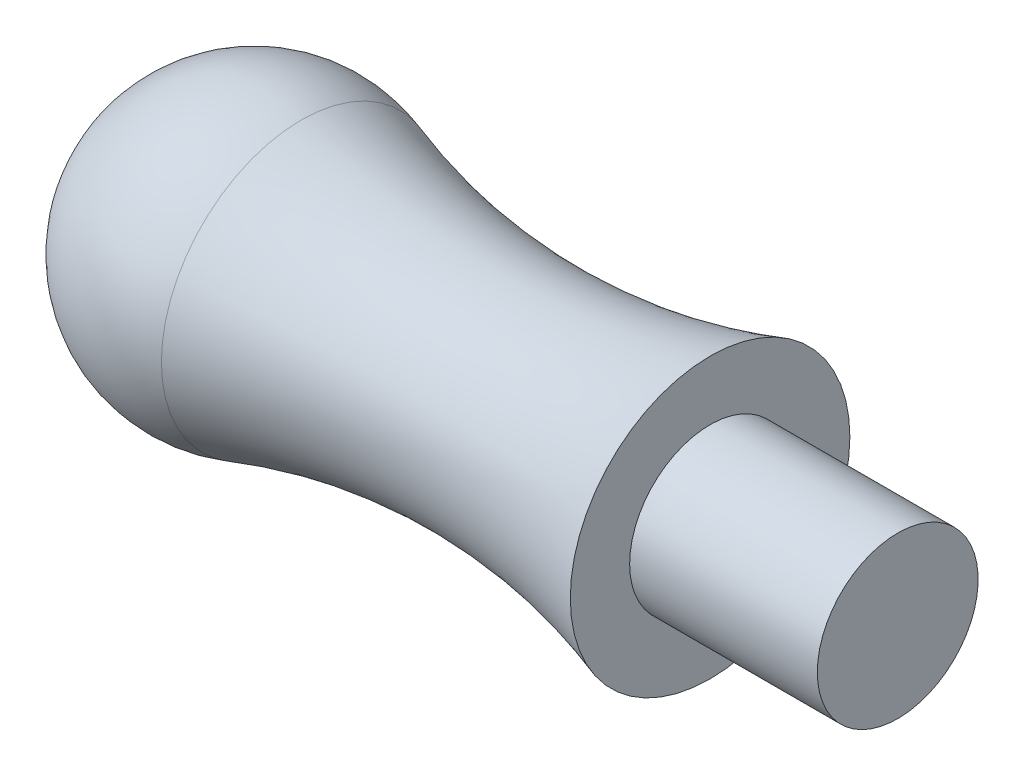
ISO-10303-21;
HEADER;
FILE_DESCRIPTION(('STEP AP214'),'2;1');
FILE_NAME('part.step','',(''),(''),'','','');
FILE_SCHEMA(('AUTOMOTIVE_DESIGN { 1 0 10303 214 1 1 1 1 }'));
ENDSEC;
DATA;
#1=APPLICATION_CONTEXT('core data for automotive mechanical design processes');
#2=APPLICATION_PROTOCOL_DEFINITION('international standard','automotive_design',2000,#1);
#3=PRODUCT_CONTEXT('',#1,'mechanical');
#4=PRODUCT('Part','Part','',(#3));
#5=PRODUCT_RELATED_PRODUCT_CATEGORY('part','',(#4));
#6=PRODUCT_DEFINITION_FORMATION('','',#4);
#7=PRODUCT_DEFINITION_CONTEXT('part definition',#1,'design');
#8=PRODUCT_DEFINITION('design','',#6,#7);
#9=PRODUCT_DEFINITION_SHAPE('','',#8);
#10=(LENGTH_UNIT() NAMED_UNIT(*) SI_UNIT(.MILLI.,.METRE.));
#11=(NAMED_UNIT(*) PLANE_ANGLE_UNIT() SI_UNIT($,.RADIAN.));
#12=(NAMED_UNIT(*) SI_UNIT($,.STERADIAN.) SOLID_ANGLE_UNIT());
#13=UNCERTAINTY_MEASURE_WITH_UNIT(LENGTH_MEASURE(1.E-05),#10,'distance_accuracy_value','');
#14=(GEOMETRIC_REPRESENTATION_CONTEXT(3) GLOBAL_UNCERTAINTY_ASSIGNED_CONTEXT((#13)) GLOBAL_UNIT_ASSIGNED_CONTEXT((#10,
#11,#12)) REPRESENTATION_CONTEXT('',''));
#15=CARTESIAN_POINT('',(0.,0.,0.));
#16=DIRECTION('',(0.,0.,1.));
#17=DIRECTION('',(1.,0.,0.));
#18=AXIS2_PLACEMENT_3D('',#15,#16,#17);
#19=CARTESIAN_POINT('',(9.37383177570094,0.,0.));
#20=DIRECTION('',(-1.,0.,0.));
#21=DIRECTION('',(0.,0.,1.));
#22=AXIS2_PLACEMENT_3D('',#19,#20,#21);
#23=TOROIDAL_SURFACE('',#22,27.9710793113326,24.);
#24=CARTESIAN_POINT('',(1.74766355140187,0.,0.));
#25=DIRECTION('',(-1.,0.,0.));
#26=DIRECTION('',(0.,0.,1.));
#27=AXIS2_PLACEMENT_3D('',#24,#25,#26);
#28=CIRCLE('',#27,5.21494699024845);
#29=CARTESIAN_POINT('',(1.74766355140187,0.,5.21494699024845));
#30=VERTEX_POINT('',#29);
#31=EDGE_CURVE('E10',#30,#30,#28,.T.);
#32=ORIENTED_EDGE('',*,*,#31,.F.);
#33=EDGE_LOOP('',(#32));
#34=FACE_BOUND('',#33,.T.);
#35=CARTESIAN_POINT('',(17.,0.,0.));
#36=DIRECTION('',(-1.,0.,0.));
#37=DIRECTION('',(0.,0.,1.));
#38=AXIS2_PLACEMENT_3D('',#35,#36,#37);
#39=CIRCLE('',#38,5.21494699024845);
#40=CARTESIAN_POINT('',(17.,0.,5.21494699024845));
#41=VERTEX_POINT('',#40);
#42=EDGE_CURVE('E60',#41,#41,#39,.T.);
#43=ORIENTED_EDGE('',*,*,#42,.T.);
#44=EDGE_LOOP('',(#43));
#45=FACE_BOUND('',#44,.T.);
#46=ADVANCED_FACE('F43',(#34,#45),#23,.F.);
#47=CARTESIAN_POINT('',(0.,0.,0.));
#48=DIRECTION('',(-1.,0.,0.));
#49=DIRECTION('',(0.,1.,0.));
#50=AXIS2_PLACEMENT_3D('',#47,#48,#49);
#51=SPHERICAL_SURFACE('',#50,5.5);
#52=ORIENTED_EDGE('',*,*,#31,.T.);
#53=EDGE_LOOP('',(#52));
#54=FACE_BOUND('',#53,.T.);
#55=ADVANCED_FACE('F80',(#54),#51,.T.);
#56=CARTESIAN_POINT('',(24.,3.,0.));
#57=DIRECTION('',(-1.,0.,0.));
#58=DIRECTION('',(0.,0.,1.));
#59=AXIS2_PLACEMENT_3D('',#56,#57,#58);
#60=PLANE('',#59);
#61=CARTESIAN_POINT('',(24.,0.,0.));
#62=DIRECTION('',(-1.,0.,0.));
#63=DIRECTION('',(0.,0.,1.));
#64=AXIS2_PLACEMENT_3D('',#61,#62,#63);
#65=CIRCLE('',#64,3.);
#66=CARTESIAN_POINT('',(24.,0.,3.));
#67=VERTEX_POINT('',#66);
#68=EDGE_CURVE('E49',#67,#67,#65,.T.);
#69=ORIENTED_EDGE('',*,*,#68,.F.);
#70=EDGE_LOOP('',(#69));
#71=FACE_BOUND('',#70,.T.);
#72=ADVANCED_FACE('F75',(#71),#60,.F.);
#73=CARTESIAN_POINT('',(0.,0.,0.));
#74=DIRECTION('',(-1.,0.,0.));
#75=DIRECTION('',(0.,0.,1.));
#76=AXIS2_PLACEMENT_3D('',#73,#74,#75);
#77=CYLINDRICAL_SURFACE('',#76,3.);
#78=CARTESIAN_POINT('',(17.,0.,0.));
#79=DIRECTION('',(-1.,0.,0.));
#80=DIRECTION('',(0.,0.,1.));
#81=AXIS2_PLACEMENT_3D('',#78,#79,#80);
#82=CIRCLE('',#81,3.);
#83=CARTESIAN_POINT('',(17.,0.,3.));
#84=VERTEX_POINT('',#83);
#85=EDGE_CURVE('E54',#84,#84,#82,.T.);
#86=ORIENTED_EDGE('',*,*,#85,.F.);
#87=EDGE_LOOP('',(#86));
#88=FACE_BOUND('',#87,.T.);
#89=ORIENTED_EDGE('',*,*,#68,.T.);
#90=EDGE_LOOP('',(#89));
#91=FACE_BOUND('',#90,.T.);
#92=ADVANCED_FACE('F70',(#88,#91),#77,.T.);
#93=CARTESIAN_POINT('',(17.,5.21494699024845,0.));
#94=DIRECTION('',(-1.,0.,0.));
#95=DIRECTION('',(0.,0.,1.));
#96=AXIS2_PLACEMENT_3D('',#93,#94,#95);
#97=PLANE('',#96);
#98=ORIENTED_EDGE('',*,*,#42,.F.);
#99=EDGE_LOOP('',(#98));
#100=FACE_BOUND('',#99,.T.);
#101=ORIENTED_EDGE('',*,*,#85,.T.);
#102=EDGE_LOOP('',(#101));
#103=FACE_BOUND('',#102,.T.);
#104=ADVANCED_FACE('F67',(#100,#103),#97,.F.);
#105=CLOSED_SHELL('',(#46,#55,#72,#92,#104));
#106=MANIFOLD_SOLID_BREP('B2',#105);
#107=ADVANCED_BREP_SHAPE_REPRESENTATION('',(#18,#106),#14);
#108=SHAPE_DEFINITION_REPRESENTATION(#9,#107);
ENDSEC;
END-ISO-10303-21;
